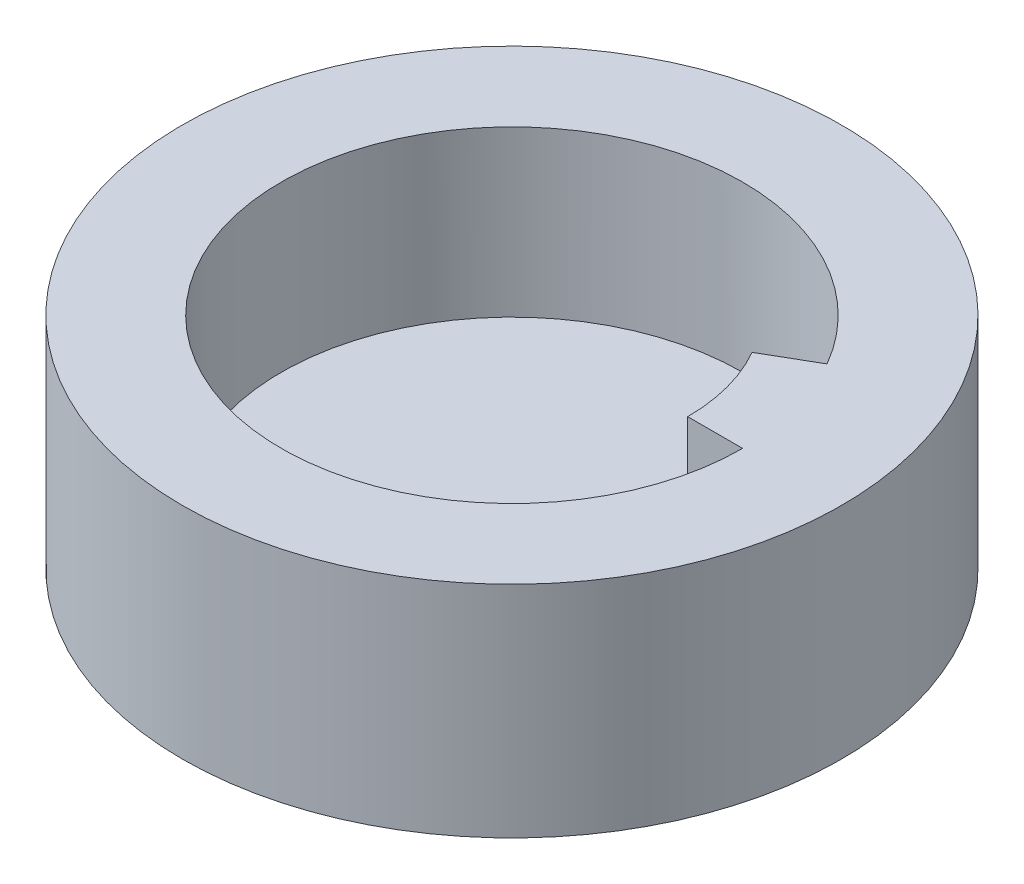
ISO-10303-21;
HEADER;
FILE_DESCRIPTION(('STEP AP214'),'2;1');
FILE_NAME('part.step','',(''),(''),'','','');
FILE_SCHEMA(('AUTOMOTIVE_DESIGN { 1 0 10303 214 1 1 1 1 }'));
ENDSEC;
DATA;
#1=APPLICATION_CONTEXT('core data for automotive mechanical design processes');
#2=APPLICATION_PROTOCOL_DEFINITION('international standard','automotive_design',2000,#1);
#3=PRODUCT_CONTEXT('',#1,'mechanical');
#4=PRODUCT('Part','Part','',(#3));
#5=PRODUCT_RELATED_PRODUCT_CATEGORY('part','',(#4));
#6=PRODUCT_DEFINITION_FORMATION('','',#4);
#7=PRODUCT_DEFINITION_CONTEXT('part definition',#1,'design');
#8=PRODUCT_DEFINITION('design','',#6,#7);
#9=PRODUCT_DEFINITION_SHAPE('','',#8);
#10=(LENGTH_UNIT() NAMED_UNIT(*) SI_UNIT(.MILLI.,.METRE.));
#11=(NAMED_UNIT(*) PLANE_ANGLE_UNIT() SI_UNIT($,.RADIAN.));
#12=(NAMED_UNIT(*) SI_UNIT($,.STERADIAN.) SOLID_ANGLE_UNIT());
#13=UNCERTAINTY_MEASURE_WITH_UNIT(LENGTH_MEASURE(1.E-05),#10,'distance_accuracy_value','');
#14=(GEOMETRIC_REPRESENTATION_CONTEXT(3) GLOBAL_UNCERTAINTY_ASSIGNED_CONTEXT((#13)) GLOBAL_UNIT_ASSIGNED_CONTEXT((#10,
#11,#12)) REPRESENTATION_CONTEXT('',''));
#15=CARTESIAN_POINT('',(0.,0.,0.));
#16=DIRECTION('',(0.,0.,1.));
#17=DIRECTION('',(1.,0.,0.));
#18=AXIS2_PLACEMENT_3D('',#15,#16,#17);
#19=CARTESIAN_POINT('',(0.,4.,0.));
#20=DIRECTION('',(0.,-1.,0.));
#21=DIRECTION('',(0.,0.,-1.));
#22=AXIS2_PLACEMENT_3D('',#19,#20,#21);
#23=CYLINDRICAL_SURFACE('',#22,4.2);
#24=CARTESIAN_POINT('',(0.,1.,0.));
#25=DIRECTION('',(0.,1.,0.));
#26=DIRECTION('',(0.,0.,1.));
#27=AXIS2_PLACEMENT_3D('',#24,#25,#26);
#28=CIRCLE('',#27,4.2);
#29=CARTESIAN_POINT('',(0.,1.,4.2));
#30=VERTEX_POINT('',#29);
#31=EDGE_CURVE('E11',#30,#30,#28,.T.);
#32=ORIENTED_EDGE('',*,*,#31,.F.);
#33=EDGE_LOOP('',(#32));
#34=FACE_BOUND('',#33,.T.);
#35=CARTESIAN_POINT('',(0.,2.5,0.));
#36=DIRECTION('',(0.,1.,0.));
#37=DIRECTION('',(0.,0.,1.));
#38=AXIS2_PLACEMENT_3D('',#35,#36,#37);
#39=CIRCLE('',#38,4.2);
#40=CARTESIAN_POINT('',(4.2,2.5,0.));
#41=VERTEX_POINT('',#40);
#42=CARTESIAN_POINT('',(3.63730669589466,2.5,-2.09999999999998));
#43=VERTEX_POINT('',#42);
#44=EDGE_CURVE('E53',#41,#43,#39,.T.);
#45=ORIENTED_EDGE('',*,*,#44,.T.);
#46=DIRECTION('',(0.,1.,0.));
#47=VECTOR('',#46,1.);
#48=CARTESIAN_POINT('',(3.63730669589465,2.5,-2.09999999999998));
#49=LINE('',#48,#47);
#50=CARTESIAN_POINT('',(3.63730669589465,4.,-2.09999999999998));
#51=VERTEX_POINT('',#50);
#52=EDGE_CURVE('E109',#43,#51,#49,.T.);
#53=ORIENTED_EDGE('',*,*,#52,.T.);
#54=CARTESIAN_POINT('',(0.,4.,0.));
#55=DIRECTION('',(0.,1.,0.));
#56=DIRECTION('',(0.,0.,1.));
#57=AXIS2_PLACEMENT_3D('',#54,#55,#56);
#58=CIRCLE('',#57,4.2);
#59=CARTESIAN_POINT('',(4.2,4.,0.));
#60=VERTEX_POINT('',#59);
#61=EDGE_CURVE('E111',#51,#60,#58,.T.);
#62=ORIENTED_EDGE('',*,*,#61,.T.);
#63=DIRECTION('',(0.,1.,0.));
#64=VECTOR('',#63,1.);
#65=CARTESIAN_POINT('',(4.2,2.5,0.));
#66=LINE('',#65,#64);
#67=EDGE_CURVE('E58',#41,#60,#66,.T.);
#68=ORIENTED_EDGE('',*,*,#67,.F.);
#69=EDGE_LOOP('',(#45,#53,#62,#68));
#70=FACE_BOUND('',#69,.T.);
#71=ADVANCED_FACE('F37',(#34,#70),#23,.F.);
#72=CARTESIAN_POINT('',(0.,4.,0.));
#73=DIRECTION('',(0.,-1.,0.));
#74=DIRECTION('',(0.,0.,-1.));
#75=AXIS2_PLACEMENT_3D('',#72,#73,#74);
#76=CYLINDRICAL_SURFACE('',#75,6.);
#77=CARTESIAN_POINT('',(0.,4.,0.));
#78=DIRECTION('',(0.,1.,0.));
#79=DIRECTION('',(0.,0.,1.));
#80=AXIS2_PLACEMENT_3D('',#77,#78,#79);
#81=CIRCLE('',#80,6.);
#82=CARTESIAN_POINT('',(0.,4.,6.));
#83=VERTEX_POINT('',#82);
#84=EDGE_CURVE('E45',#83,#83,#81,.T.);
#85=ORIENTED_EDGE('',*,*,#84,.F.);
#86=EDGE_LOOP('',(#85));
#87=FACE_BOUND('',#86,.T.);
#88=CARTESIAN_POINT('',(0.,0.,0.));
#89=DIRECTION('',(0.,1.,0.));
#90=DIRECTION('',(0.,0.,1.));
#91=AXIS2_PLACEMENT_3D('',#88,#89,#90);
#92=CIRCLE('',#91,6.);
#93=CARTESIAN_POINT('',(0.,0.,6.));
#94=VERTEX_POINT('',#93);
#95=EDGE_CURVE('E40',#94,#94,#92,.T.);
#96=ORIENTED_EDGE('',*,*,#95,.T.);
#97=EDGE_LOOP('',(#96));
#98=FACE_BOUND('',#97,.T.);
#99=ADVANCED_FACE('F117',(#87,#98),#76,.T.);
#100=CARTESIAN_POINT('',(0.,4.,0.));
#101=DIRECTION('',(0.,1.,0.));
#102=DIRECTION('',(0.,0.,1.));
#103=AXIS2_PLACEMENT_3D('',#100,#101,#102);
#104=PLANE('',#103);
#105=ORIENTED_EDGE('',*,*,#61,.F.);
#106=DIRECTION('',(0.866025403784442,0.,-0.499999999999995));
#107=VECTOR('',#106,1.);
#108=CARTESIAN_POINT('',(0.,4.,0.));
#109=LINE('',#108,#107);
#110=CARTESIAN_POINT('',(2.77128129211021,4.,-1.59999999999998));
#111=VERTEX_POINT('',#110);
#112=EDGE_CURVE('E101',#111,#51,#109,.T.);
#113=ORIENTED_EDGE('',*,*,#112,.F.);
#114=CARTESIAN_POINT('',(0.,4.,0.));
#115=DIRECTION('',(0.,1.,0.));
#116=DIRECTION('',(0.,0.,1.));
#117=AXIS2_PLACEMENT_3D('',#114,#115,#116);
#118=CIRCLE('',#117,3.2);
#119=CARTESIAN_POINT('',(3.2,4.,0.));
#120=VERTEX_POINT('',#119);
#121=EDGE_CURVE('E105',#120,#111,#118,.T.);
#122=ORIENTED_EDGE('',*,*,#121,.F.);
#123=DIRECTION('',(-1.,0.,0.));
#124=VECTOR('',#123,1.);
#125=CARTESIAN_POINT('',(0.,4.,0.));
#126=LINE('',#125,#124);
#127=EDGE_CURVE('E89',#60,#120,#126,.T.);
#128=ORIENTED_EDGE('',*,*,#127,.F.);
#129=EDGE_LOOP('',(#105,#113,#122,#128));
#130=FACE_BOUND('',#129,.T.);
#131=ORIENTED_EDGE('',*,*,#84,.T.);
#132=EDGE_LOOP('',(#131));
#133=FACE_BOUND('',#132,.T.);
#134=ADVANCED_FACE('F115',(#130,#133),#104,.T.);
#135=CARTESIAN_POINT('',(0.,0.,0.));
#136=DIRECTION('',(0.,1.,0.));
#137=DIRECTION('',(0.,0.,1.));
#138=AXIS2_PLACEMENT_3D('',#135,#136,#137);
#139=PLANE('',#138);
#140=ORIENTED_EDGE('',*,*,#95,.F.);
#141=EDGE_LOOP('',(#140));
#142=FACE_BOUND('',#141,.T.);
#143=ADVANCED_FACE('F123',(#142),#139,.F.);
#144=CARTESIAN_POINT('',(0.,1.,0.));
#145=DIRECTION('',(0.,1.,0.));
#146=DIRECTION('',(0.,0.,1.));
#147=AXIS2_PLACEMENT_3D('',#144,#145,#146);
#148=PLANE('',#147);
#149=ORIENTED_EDGE('',*,*,#31,.T.);
#150=EDGE_LOOP('',(#149));
#151=FACE_BOUND('',#150,.T.);
#152=ADVANCED_FACE('F125',(#151),#148,.T.);
#153=CARTESIAN_POINT('',(0.,2.5,0.));
#154=DIRECTION('',(0.499999999999995,0.,0.866025403784442));
#155=DIRECTION('',(0.866025403784442,0.,-0.499999999999995));
#156=AXIS2_PLACEMENT_3D('',#153,#154,#155);
#157=PLANE('',#156);
#158=ORIENTED_EDGE('',*,*,#112,.T.);
#159=ORIENTED_EDGE('',*,*,#52,.F.);
#160=DIRECTION('',(0.866025403784442,0.,-0.499999999999995));
#161=VECTOR('',#160,1.);
#162=CARTESIAN_POINT('',(0.,2.5,0.));
#163=LINE('',#162,#161);
#164=CARTESIAN_POINT('',(2.77128129211021,2.5,-1.59999999999998));
#165=VERTEX_POINT('',#164);
#166=EDGE_CURVE('E106',#165,#43,#163,.T.);
#167=ORIENTED_EDGE('',*,*,#166,.F.);
#168=DIRECTION('',(0.,1.,0.));
#169=VECTOR('',#168,1.);
#170=CARTESIAN_POINT('',(2.77128129211021,2.5,-1.59999999999998));
#171=LINE('',#170,#169);
#172=EDGE_CURVE('E92',#165,#111,#171,.T.);
#173=ORIENTED_EDGE('',*,*,#172,.T.);
#174=EDGE_LOOP('',(#158,#159,#167,#173));
#175=FACE_BOUND('',#174,.T.);
#176=ADVANCED_FACE('F131',(#175),#157,.F.);
#177=CARTESIAN_POINT('',(0.,2.5,0.));
#178=DIRECTION('',(0.,0.,-1.));
#179=DIRECTION('',(-1.,0.,0.));
#180=AXIS2_PLACEMENT_3D('',#177,#178,#179);
#181=PLANE('',#180);
#182=ORIENTED_EDGE('',*,*,#127,.T.);
#183=DIRECTION('',(0.,1.,0.));
#184=VECTOR('',#183,1.);
#185=CARTESIAN_POINT('',(3.2,2.5,0.));
#186=LINE('',#185,#184);
#187=CARTESIAN_POINT('',(3.2,2.5,0.));
#188=VERTEX_POINT('',#187);
#189=EDGE_CURVE('E86',#188,#120,#186,.T.);
#190=ORIENTED_EDGE('',*,*,#189,.F.);
#191=DIRECTION('',(-1.,0.,0.));
#192=VECTOR('',#191,1.);
#193=CARTESIAN_POINT('',(0.,2.5,0.));
#194=LINE('',#193,#192);
#195=EDGE_CURVE('E77',#41,#188,#194,.T.);
#196=ORIENTED_EDGE('',*,*,#195,.F.);
#197=ORIENTED_EDGE('',*,*,#67,.T.);
#198=EDGE_LOOP('',(#182,#190,#196,#197));
#199=FACE_BOUND('',#198,.T.);
#200=ADVANCED_FACE('F87',(#199),#181,.F.);
#201=CARTESIAN_POINT('',(0.,2.5,0.));
#202=DIRECTION('',(0.,1.,0.));
#203=DIRECTION('',(0.,0.,1.));
#204=AXIS2_PLACEMENT_3D('',#201,#202,#203);
#205=CYLINDRICAL_SURFACE('',#204,3.2);
#206=ORIENTED_EDGE('',*,*,#121,.T.);
#207=ORIENTED_EDGE('',*,*,#172,.F.);
#208=CARTESIAN_POINT('',(0.,2.5,0.));
#209=DIRECTION('',(0.,1.,0.));
#210=DIRECTION('',(0.,0.,1.));
#211=AXIS2_PLACEMENT_3D('',#208,#209,#210);
#212=CIRCLE('',#211,3.2);
#213=EDGE_CURVE('E81',#188,#165,#212,.T.);
#214=ORIENTED_EDGE('',*,*,#213,.F.);
#215=ORIENTED_EDGE('',*,*,#189,.T.);
#216=EDGE_LOOP('',(#206,#207,#214,#215));
#217=FACE_BOUND('',#216,.T.);
#218=ADVANCED_FACE('F94',(#217),#205,.F.);
#219=CARTESIAN_POINT('',(0.,2.5,0.));
#220=DIRECTION('',(0.,1.,0.));
#221=DIRECTION('',(0.,0.,1.));
#222=AXIS2_PLACEMENT_3D('',#219,#220,#221);
#223=PLANE('',#222);
#224=ORIENTED_EDGE('',*,*,#166,.T.);
#225=ORIENTED_EDGE('',*,*,#44,.F.);
#226=ORIENTED_EDGE('',*,*,#195,.T.);
#227=ORIENTED_EDGE('',*,*,#213,.T.);
#228=EDGE_LOOP('',(#224,#225,#226,#227));
#229=FACE_BOUND('',#228,.T.);
#230=ADVANCED_FACE('F79',(#229),#223,.F.);
#231=CLOSED_SHELL('',(#71,#99,#134,#143,#152,#176,#200,#218,#230));
#232=MANIFOLD_SOLID_BREP('B2',#231);
#233=ADVANCED_BREP_SHAPE_REPRESENTATION('',(#18,#232),#14);
#234=SHAPE_DEFINITION_REPRESENTATION(#9,#233);
ENDSEC;
END-ISO-10303-21;
